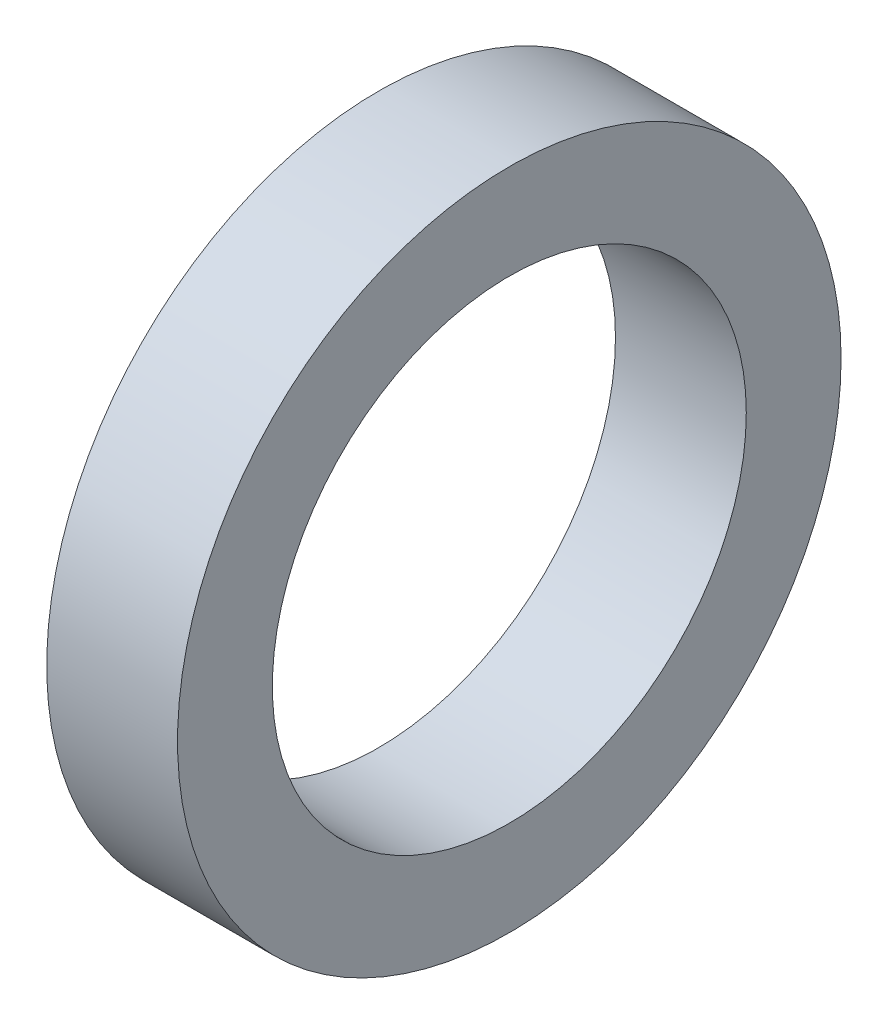
ISO-10303-21;
HEADER;
FILE_DESCRIPTION(('STEP AP214'),'2;1');
FILE_NAME('part.step','',(''),(''),'','','');
FILE_SCHEMA(('AUTOMOTIVE_DESIGN { 1 0 10303 214 1 1 1 1 }'));
ENDSEC;
DATA;
#1=APPLICATION_CONTEXT('core data for automotive mechanical design processes');
#2=APPLICATION_PROTOCOL_DEFINITION('international standard','automotive_design',2000,#1);
#3=PRODUCT_CONTEXT('',#1,'mechanical');
#4=PRODUCT('Part','Part','',(#3));
#5=PRODUCT_RELATED_PRODUCT_CATEGORY('part','',(#4));
#6=PRODUCT_DEFINITION_FORMATION('','',#4);
#7=PRODUCT_DEFINITION_CONTEXT('part definition',#1,'design');
#8=PRODUCT_DEFINITION('design','',#6,#7);
#9=PRODUCT_DEFINITION_SHAPE('','',#8);
#10=(LENGTH_UNIT() NAMED_UNIT(*) SI_UNIT(.MILLI.,.METRE.));
#11=(NAMED_UNIT(*) PLANE_ANGLE_UNIT() SI_UNIT($,.RADIAN.));
#12=(NAMED_UNIT(*) SI_UNIT($,.STERADIAN.) SOLID_ANGLE_UNIT());
#13=UNCERTAINTY_MEASURE_WITH_UNIT(LENGTH_MEASURE(1.E-05),#10,'distance_accuracy_value','');
#14=(GEOMETRIC_REPRESENTATION_CONTEXT(3) GLOBAL_UNCERTAINTY_ASSIGNED_CONTEXT((#13)) GLOBAL_UNIT_ASSIGNED_CONTEXT((#10,
#11,#12)) REPRESENTATION_CONTEXT('',''));
#15=CARTESIAN_POINT('',(0.,0.,0.));
#16=DIRECTION('',(0.,0.,1.));
#17=DIRECTION('',(1.,0.,0.));
#18=AXIS2_PLACEMENT_3D('',#15,#16,#17);
#19=CARTESIAN_POINT('',(3.5052,0.,0.));
#20=DIRECTION('',(1.,0.,0.));
#21=DIRECTION('',(0.,0.,-1.));
#22=AXIS2_PLACEMENT_3D('',#19,#20,#21);
#23=PLANE('',#22);
#24=CARTESIAN_POINT('',(3.5052,0.,0.));
#25=DIRECTION('',(1.,0.,0.));
#26=DIRECTION('',(0.,0.,-1.));
#27=AXIS2_PLACEMENT_3D('',#24,#25,#26);
#28=CIRCLE('',#27,8.89);
#29=CARTESIAN_POINT('',(3.5052,0.,-8.89));
#30=VERTEX_POINT('',#29);
#31=EDGE_CURVE('E10',#30,#30,#28,.T.);
#32=ORIENTED_EDGE('',*,*,#31,.T.);
#33=EDGE_LOOP('',(#32));
#34=FACE_BOUND('',#33,.T.);
#35=CARTESIAN_POINT('',(3.5052,0.,0.));
#36=DIRECTION('',(1.,0.,0.));
#37=DIRECTION('',(0.,0.,-1.));
#38=AXIS2_PLACEMENT_3D('',#35,#36,#37);
#39=CIRCLE('',#38,6.35);
#40=CARTESIAN_POINT('',(3.5052,0.,-6.35));
#41=VERTEX_POINT('',#40);
#42=EDGE_CURVE('E43',#41,#41,#39,.T.);
#43=ORIENTED_EDGE('',*,*,#42,.F.);
#44=EDGE_LOOP('',(#43));
#45=FACE_BOUND('',#44,.T.);
#46=ADVANCED_FACE('F32',(#34,#45),#23,.T.);
#47=CARTESIAN_POINT('',(0.,0.,0.));
#48=DIRECTION('',(1.,0.,0.));
#49=DIRECTION('',(0.,0.,-1.));
#50=AXIS2_PLACEMENT_3D('',#47,#48,#49);
#51=PLANE('',#50);
#52=CARTESIAN_POINT('',(0.,0.,0.));
#53=DIRECTION('',(1.,0.,0.));
#54=DIRECTION('',(0.,0.,-1.));
#55=AXIS2_PLACEMENT_3D('',#52,#53,#54);
#56=CIRCLE('',#55,8.89);
#57=CARTESIAN_POINT('',(0.,0.,-8.89));
#58=VERTEX_POINT('',#57);
#59=EDGE_CURVE('E36',#58,#58,#56,.T.);
#60=ORIENTED_EDGE('',*,*,#59,.F.);
#61=EDGE_LOOP('',(#60));
#62=FACE_BOUND('',#61,.T.);
#63=CARTESIAN_POINT('',(0.,0.,0.));
#64=DIRECTION('',(1.,0.,0.));
#65=DIRECTION('',(0.,0.,-1.));
#66=AXIS2_PLACEMENT_3D('',#63,#64,#65);
#67=CIRCLE('',#66,6.35);
#68=CARTESIAN_POINT('',(0.,0.,-6.35));
#69=VERTEX_POINT('',#68);
#70=EDGE_CURVE('E45',#69,#69,#67,.T.);
#71=ORIENTED_EDGE('',*,*,#70,.T.);
#72=EDGE_LOOP('',(#71));
#73=FACE_BOUND('',#72,.T.);
#74=ADVANCED_FACE('F55',(#62,#73),#51,.F.);
#75=CARTESIAN_POINT('',(3.5052,0.,0.));
#76=DIRECTION('',(-1.,0.,0.));
#77=DIRECTION('',(0.,0.,1.));
#78=AXIS2_PLACEMENT_3D('',#75,#76,#77);
#79=CYLINDRICAL_SURFACE('',#78,8.89);
#80=ORIENTED_EDGE('',*,*,#31,.F.);
#81=EDGE_LOOP('',(#80));
#82=FACE_BOUND('',#81,.T.);
#83=ORIENTED_EDGE('',*,*,#59,.T.);
#84=EDGE_LOOP('',(#83));
#85=FACE_BOUND('',#84,.T.);
#86=ADVANCED_FACE('F34',(#82,#85),#79,.T.);
#87=CARTESIAN_POINT('',(3.5052,0.,0.));
#88=DIRECTION('',(-1.,0.,0.));
#89=DIRECTION('',(0.,0.,1.));
#90=AXIS2_PLACEMENT_3D('',#87,#88,#89);
#91=CYLINDRICAL_SURFACE('',#90,6.35);
#92=ORIENTED_EDGE('',*,*,#42,.T.);
#93=EDGE_LOOP('',(#92));
#94=FACE_BOUND('',#93,.T.);
#95=ORIENTED_EDGE('',*,*,#70,.F.);
#96=EDGE_LOOP('',(#95));
#97=FACE_BOUND('',#96,.T.);
#98=ADVANCED_FACE('F51',(#94,#97),#91,.F.);
#99=CLOSED_SHELL('',(#46,#74,#86,#98));
#100=MANIFOLD_SOLID_BREP('B2',#99);
#101=ADVANCED_BREP_SHAPE_REPRESENTATION('',(#18,#100),#14);
#102=SHAPE_DEFINITION_REPRESENTATION(#9,#101);
ENDSEC;
END-ISO-10303-21;
